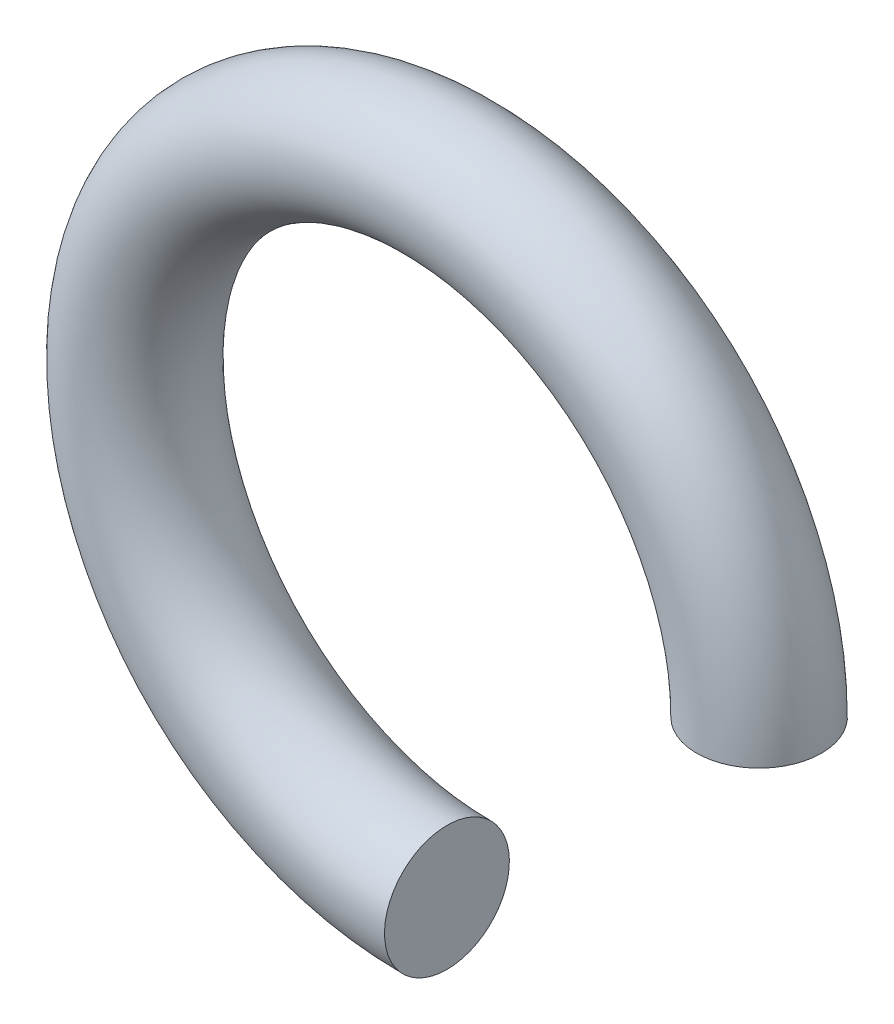
ISO-10303-21;
HEADER;
FILE_DESCRIPTION(('STEP AP214'),'2;1');
FILE_NAME('part.step','',(''),(''),'','','');
FILE_SCHEMA(('AUTOMOTIVE_DESIGN { 1 0 10303 214 1 1 1 1 }'));
ENDSEC;
DATA;
#1=APPLICATION_CONTEXT('core data for automotive mechanical design processes');
#2=APPLICATION_PROTOCOL_DEFINITION('international standard','automotive_design',2000,#1);
#3=PRODUCT_CONTEXT('',#1,'mechanical');
#4=PRODUCT('Part','Part','',(#3));
#5=PRODUCT_RELATED_PRODUCT_CATEGORY('part','',(#4));
#6=PRODUCT_DEFINITION_FORMATION('','',#4);
#7=PRODUCT_DEFINITION_CONTEXT('part definition',#1,'design');
#8=PRODUCT_DEFINITION('design','',#6,#7);
#9=PRODUCT_DEFINITION_SHAPE('','',#8);
#10=(LENGTH_UNIT() NAMED_UNIT(*) SI_UNIT(.MILLI.,.METRE.));
#11=(NAMED_UNIT(*) PLANE_ANGLE_UNIT() SI_UNIT($,.RADIAN.));
#12=(NAMED_UNIT(*) SI_UNIT($,.STERADIAN.) SOLID_ANGLE_UNIT());
#13=UNCERTAINTY_MEASURE_WITH_UNIT(LENGTH_MEASURE(1.E-05),#10,'distance_accuracy_value','');
#14=(GEOMETRIC_REPRESENTATION_CONTEXT(3) GLOBAL_UNCERTAINTY_ASSIGNED_CONTEXT((#13)) GLOBAL_UNIT_ASSIGNED_CONTEXT((#10,
#11,#12)) REPRESENTATION_CONTEXT('',''));
#15=CARTESIAN_POINT('',(0.,0.,0.));
#16=DIRECTION('',(0.,0.,1.));
#17=DIRECTION('',(1.,0.,0.));
#18=AXIS2_PLACEMENT_3D('',#15,#16,#17);
#19=CARTESIAN_POINT('',(0.,0.,0.));
#20=DIRECTION('',(0.,0.,-1.));
#21=DIRECTION('',(-1.,0.,0.));
#22=AXIS2_PLACEMENT_3D('',#19,#20,#21);
#23=TOROIDAL_SURFACE('',#22,20.,4.);
#24=CARTESIAN_POINT('',(0.,-20.,0.));
#25=DIRECTION('',(-1.,0.,0.));
#26=DIRECTION('',(0.,0.,-1.));
#27=AXIS2_PLACEMENT_3D('',#24,#25,#26);
#28=CIRCLE('',#27,4.);
#29=CARTESIAN_POINT('',(0.,-24.,0.));
#30=VERTEX_POINT('',#29);
#31=EDGE_CURVE('E10',#30,#30,#28,.T.);
#32=CARTESIAN_POINT('',(20.,0.,0.));
#33=DIRECTION('',(0.,-1.,0.));
#34=DIRECTION('',(0.,0.,-1.));
#35=AXIS2_PLACEMENT_3D('',#32,#33,#34);
#36=CIRCLE('',#35,4.);
#37=CARTESIAN_POINT('',(24.,0.,0.));
#38=VERTEX_POINT('',#37);
#39=EDGE_CURVE('E43',#38,#38,#36,.T.);
#40=CARTESIAN_POINT('',(0.,0.,0.));
#41=DIRECTION('',(0.,0.,-1.));
#42=DIRECTION('',(-1.,0.,0.));
#43=AXIS2_PLACEMENT_3D('',#40,#41,#42);
#44=CIRCLE('',#43,24.);
#45=EDGE_CURVE('',#30,#38,#44,.T.);
#46=ORIENTED_EDGE('',*,*,#31,.T.);
#47=ORIENTED_EDGE('',*,*,#39,.F.);
#48=ORIENTED_EDGE('',*,*,#45,.T.);
#49=ORIENTED_EDGE('',*,*,#45,.F.);
#50=EDGE_LOOP('',(#46,#48,#47,#49));
#51=FACE_BOUND('',#50,.T.);
#52=ADVANCED_FACE('F37',(#51),#23,.T.);
#53=CARTESIAN_POINT('',(0.,-20.,0.));
#54=DIRECTION('',(-1.,0.,0.));
#55=DIRECTION('',(0.,0.,-1.));
#56=AXIS2_PLACEMENT_3D('',#53,#54,#55);
#57=PLANE('',#56);
#58=ORIENTED_EDGE('',*,*,#31,.F.);
#59=EDGE_LOOP('',(#58));
#60=FACE_BOUND('',#59,.T.);
#61=ADVANCED_FACE('F52',(#60),#57,.F.);
#62=CARTESIAN_POINT('',(20.,0.,0.));
#63=DIRECTION('',(0.,-1.,0.));
#64=DIRECTION('',(0.,0.,-1.));
#65=AXIS2_PLACEMENT_3D('',#62,#63,#64);
#66=PLANE('',#65);
#67=ORIENTED_EDGE('',*,*,#39,.T.);
#68=EDGE_LOOP('',(#67));
#69=FACE_BOUND('',#68,.T.);
#70=ADVANCED_FACE('F49',(#69),#66,.T.);
#71=CLOSED_SHELL('',(#52,#61,#70));
#72=MANIFOLD_SOLID_BREP('B2',#71);
#73=ADVANCED_BREP_SHAPE_REPRESENTATION('',(#18,#72),#14);
#74=SHAPE_DEFINITION_REPRESENTATION(#9,#73);
ENDSEC;
END-ISO-10303-21;
